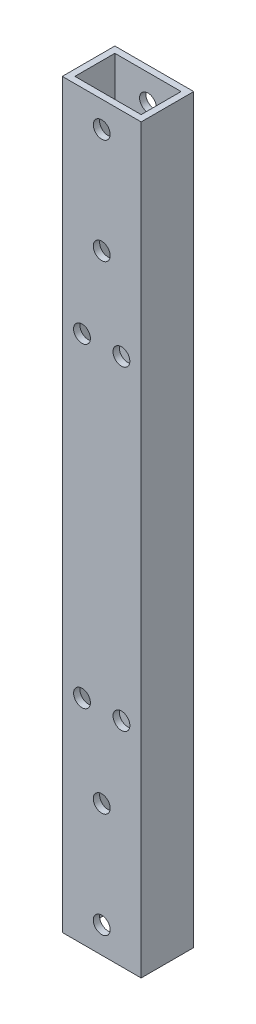
ISO-10303-21;
HEADER;
FILE_DESCRIPTION(('STEP AP214'),'2;1');
FILE_NAME('part.step','',(''),(''),'','','');
FILE_SCHEMA(('AUTOMOTIVE_DESIGN { 1 0 10303 214 1 1 1 1 }'));
ENDSEC;
DATA;
#1=APPLICATION_CONTEXT('core data for automotive mechanical design processes');
#2=APPLICATION_PROTOCOL_DEFINITION('international standard','automotive_design',2000,#1);
#3=PRODUCT_CONTEXT('',#1,'mechanical');
#4=PRODUCT('Part','Part','',(#3));
#5=PRODUCT_RELATED_PRODUCT_CATEGORY('part','',(#4));
#6=PRODUCT_DEFINITION_FORMATION('','',#4);
#7=PRODUCT_DEFINITION_CONTEXT('part definition',#1,'design');
#8=PRODUCT_DEFINITION('design','',#6,#7);
#9=PRODUCT_DEFINITION_SHAPE('','',#8);
#10=(LENGTH_UNIT() NAMED_UNIT(*) SI_UNIT(.MILLI.,.METRE.));
#11=(NAMED_UNIT(*) PLANE_ANGLE_UNIT() SI_UNIT($,.RADIAN.));
#12=(NAMED_UNIT(*) SI_UNIT($,.STERADIAN.) SOLID_ANGLE_UNIT());
#13=UNCERTAINTY_MEASURE_WITH_UNIT(LENGTH_MEASURE(1.E-05),#10,'distance_accuracy_value','');
#14=(GEOMETRIC_REPRESENTATION_CONTEXT(3) GLOBAL_UNCERTAINTY_ASSIGNED_CONTEXT((#13)) GLOBAL_UNIT_ASSIGNED_CONTEXT((#10,
#11,#12)) REPRESENTATION_CONTEXT('',''));
#15=CARTESIAN_POINT('',(0.,0.,0.));
#16=DIRECTION('',(0.,0.,1.));
#17=DIRECTION('',(1.,0.,0.));
#18=AXIS2_PLACEMENT_3D('',#15,#16,#17);
#19=CARTESIAN_POINT('',(0.,70.5,0.));
#20=DIRECTION('',(0.,1.,0.));
#21=DIRECTION('',(0.,0.,1.));
#22=AXIS2_PLACEMENT_3D('',#19,#20,#21);
#23=PLANE('',#22);
#24=DIRECTION('',(0.,0.,-1.));
#25=VECTOR('',#24,1.);
#26=CARTESIAN_POINT('',(7.5,70.5,-5.));
#27=LINE('',#26,#25);
#28=CARTESIAN_POINT('',(7.5,70.5,5.));
#29=VERTEX_POINT('',#28);
#30=CARTESIAN_POINT('',(7.5,70.5,-5.));
#31=VERTEX_POINT('',#30);
#32=EDGE_CURVE('E165',#29,#31,#27,.T.);
#33=ORIENTED_EDGE('',*,*,#32,.T.);
#34=DIRECTION('',(-1.,0.,0.));
#35=VECTOR('',#34,1.);
#36=CARTESIAN_POINT('',(-7.5,70.5,-5.));
#37=LINE('',#36,#35);
#38=CARTESIAN_POINT('',(-7.5,70.5,-5.));
#39=VERTEX_POINT('',#38);
#40=EDGE_CURVE('E169',#31,#39,#37,.T.);
#41=ORIENTED_EDGE('',*,*,#40,.T.);
#42=DIRECTION('',(0.,0.,1.));
#43=VECTOR('',#42,1.);
#44=CARTESIAN_POINT('',(-7.5,70.5,-5.));
#45=LINE('',#44,#43);
#46=CARTESIAN_POINT('',(-7.5,70.5,5.));
#47=VERTEX_POINT('',#46);
#48=EDGE_CURVE('E173',#39,#47,#45,.T.);
#49=ORIENTED_EDGE('',*,*,#48,.T.);
#50=DIRECTION('',(1.,0.,0.));
#51=VECTOR('',#50,1.);
#52=CARTESIAN_POINT('',(-7.5,70.5,5.));
#53=LINE('',#52,#51);
#54=EDGE_CURVE('E176',#47,#29,#53,.T.);
#55=ORIENTED_EDGE('',*,*,#54,.T.);
#56=EDGE_LOOP('',(#33,#41,#49,#55));
#57=FACE_BOUND('',#56,.T.);
#58=DIRECTION('',(1.,0.,0.));
#59=VECTOR('',#58,1.);
#60=CARTESIAN_POINT('',(-6.3,70.5,3.8));
#61=LINE('',#60,#59);
#62=CARTESIAN_POINT('',(-6.3,70.5,3.8));
#63=VERTEX_POINT('',#62);
#64=CARTESIAN_POINT('',(6.3,70.5,3.8));
#65=VERTEX_POINT('',#64);
#66=EDGE_CURVE('E124',#63,#65,#61,.T.);
#67=ORIENTED_EDGE('',*,*,#66,.F.);
#68=DIRECTION('',(0.,0.,1.));
#69=VECTOR('',#68,1.);
#70=CARTESIAN_POINT('',(-6.3,70.5,-3.8));
#71=LINE('',#70,#69);
#72=CARTESIAN_POINT('',(-6.3,70.5,-3.8));
#73=VERTEX_POINT('',#72);
#74=EDGE_CURVE('E115',#73,#63,#71,.T.);
#75=ORIENTED_EDGE('',*,*,#74,.F.);
#76=DIRECTION('',(-1.,0.,0.));
#77=VECTOR('',#76,1.);
#78=CARTESIAN_POINT('',(-6.3,70.5,-3.8));
#79=LINE('',#78,#77);
#80=CARTESIAN_POINT('',(6.3,70.5,-3.8));
#81=VERTEX_POINT('',#80);
#82=EDGE_CURVE('E141',#81,#73,#79,.T.);
#83=ORIENTED_EDGE('',*,*,#82,.F.);
#84=DIRECTION('',(0.,0.,-1.));
#85=VECTOR('',#84,1.);
#86=CARTESIAN_POINT('',(6.3,70.5,-3.8));
#87=LINE('',#86,#85);
#88=EDGE_CURVE('E137',#65,#81,#87,.T.);
#89=ORIENTED_EDGE('',*,*,#88,.F.);
#90=EDGE_LOOP('',(#67,#75,#83,#89));
#91=FACE_BOUND('',#90,.T.);
#92=ADVANCED_FACE('F47',(#57,#91),#23,.T.);
#93=CARTESIAN_POINT('',(0.,-70.5,0.));
#94=DIRECTION('',(0.,1.,0.));
#95=DIRECTION('',(0.,0.,1.));
#96=AXIS2_PLACEMENT_3D('',#93,#94,#95);
#97=PLANE('',#96);
#98=DIRECTION('',(0.,0.,-1.));
#99=VECTOR('',#98,1.);
#100=CARTESIAN_POINT('',(7.5,-70.5,-5.));
#101=LINE('',#100,#99);
#102=CARTESIAN_POINT('',(7.5,-70.5,5.));
#103=VERTEX_POINT('',#102);
#104=CARTESIAN_POINT('',(7.5,-70.5,-5.));
#105=VERTEX_POINT('',#104);
#106=EDGE_CURVE('E133',#103,#105,#101,.T.);
#107=ORIENTED_EDGE('',*,*,#106,.F.);
#108=DIRECTION('',(1.,0.,0.));
#109=VECTOR('',#108,1.);
#110=CARTESIAN_POINT('',(-7.5,-70.5,5.));
#111=LINE('',#110,#109);
#112=CARTESIAN_POINT('',(-7.5,-70.5,5.));
#113=VERTEX_POINT('',#112);
#114=EDGE_CURVE('E170',#113,#103,#111,.T.);
#115=ORIENTED_EDGE('',*,*,#114,.F.);
#116=DIRECTION('',(0.,0.,1.));
#117=VECTOR('',#116,1.);
#118=CARTESIAN_POINT('',(-7.5,-70.5,-5.));
#119=LINE('',#118,#117);
#120=CARTESIAN_POINT('',(-7.5,-70.5,-5.));
#121=VERTEX_POINT('',#120);
#122=EDGE_CURVE('E186',#121,#113,#119,.T.);
#123=ORIENTED_EDGE('',*,*,#122,.F.);
#124=DIRECTION('',(-1.,0.,0.));
#125=VECTOR('',#124,1.);
#126=CARTESIAN_POINT('',(-7.5,-70.5,-5.));
#127=LINE('',#126,#125);
#128=EDGE_CURVE('E183',#105,#121,#127,.T.);
#129=ORIENTED_EDGE('',*,*,#128,.F.);
#130=EDGE_LOOP('',(#107,#115,#123,#129));
#131=FACE_BOUND('',#130,.T.);
#132=DIRECTION('',(0.,0.,1.));
#133=VECTOR('',#132,1.);
#134=CARTESIAN_POINT('',(-6.3,-70.5,-3.8));
#135=LINE('',#134,#133);
#136=CARTESIAN_POINT('',(-6.3,-70.5,-3.8));
#137=VERTEX_POINT('',#136);
#138=CARTESIAN_POINT('',(-6.3,-70.5,3.8));
#139=VERTEX_POINT('',#138);
#140=EDGE_CURVE('E73',#137,#139,#135,.T.);
#141=ORIENTED_EDGE('',*,*,#140,.T.);
#142=DIRECTION('',(1.,0.,0.));
#143=VECTOR('',#142,1.);
#144=CARTESIAN_POINT('',(-6.3,-70.5,3.8));
#145=LINE('',#144,#143);
#146=CARTESIAN_POINT('',(6.3,-70.5,3.8));
#147=VERTEX_POINT('',#146);
#148=EDGE_CURVE('E131',#139,#147,#145,.T.);
#149=ORIENTED_EDGE('',*,*,#148,.T.);
#150=DIRECTION('',(0.,0.,-1.));
#151=VECTOR('',#150,1.);
#152=CARTESIAN_POINT('',(6.3,-70.5,-3.8));
#153=LINE('',#152,#151);
#154=CARTESIAN_POINT('',(6.3,-70.5,-3.8));
#155=VERTEX_POINT('',#154);
#156=EDGE_CURVE('E152',#147,#155,#153,.T.);
#157=ORIENTED_EDGE('',*,*,#156,.T.);
#158=DIRECTION('',(-1.,0.,0.));
#159=VECTOR('',#158,1.);
#160=CARTESIAN_POINT('',(-6.3,-70.5,-3.8));
#161=LINE('',#160,#159);
#162=EDGE_CURVE('E125',#155,#137,#161,.T.);
#163=ORIENTED_EDGE('',*,*,#162,.T.);
#164=EDGE_LOOP('',(#141,#149,#157,#163));
#165=FACE_BOUND('',#164,.T.);
#166=ADVANCED_FACE('F288',(#131,#165),#97,.F.);
#167=CARTESIAN_POINT('',(7.5,70.5,-5.));
#168=DIRECTION('',(-1.,0.,0.));
#169=DIRECTION('',(0.,0.,1.));
#170=AXIS2_PLACEMENT_3D('',#167,#168,#169);
#171=PLANE('',#170);
#172=ORIENTED_EDGE('',*,*,#106,.T.);
#173=DIRECTION('',(0.,-1.,0.));
#174=VECTOR('',#173,1.);
#175=CARTESIAN_POINT('',(7.5,70.5,-5.));
#176=LINE('',#175,#174);
#177=EDGE_CURVE('E11',#31,#105,#176,.T.);
#178=ORIENTED_EDGE('',*,*,#177,.F.);
#179=ORIENTED_EDGE('',*,*,#32,.F.);
#180=DIRECTION('',(0.,-1.,0.));
#181=VECTOR('',#180,1.);
#182=CARTESIAN_POINT('',(7.5,70.5,5.));
#183=LINE('',#182,#181);
#184=EDGE_CURVE('E179',#29,#103,#183,.T.);
#185=ORIENTED_EDGE('',*,*,#184,.T.);
#186=EDGE_LOOP('',(#172,#178,#179,#185));
#187=FACE_BOUND('',#186,.T.);
#188=ADVANCED_FACE('F49',(#187),#171,.F.);
#189=CARTESIAN_POINT('',(-7.5,70.5,-5.));
#190=DIRECTION('',(0.,0.,1.));
#191=DIRECTION('',(1.,0.,0.));
#192=AXIS2_PLACEMENT_3D('',#189,#190,#191);
#193=PLANE('',#192);
#194=CARTESIAN_POINT('',(0.,-65.5,-5.));
#195=DIRECTION('',(0.,0.,-1.));
#196=DIRECTION('',(-1.,0.,0.));
#197=AXIS2_PLACEMENT_3D('',#194,#195,#196);
#198=CIRCLE('',#197,1.60000000000001);
#199=CARTESIAN_POINT('',(-1.60000000000001,-65.5,-5.));
#200=VERTEX_POINT('',#199);
#201=EDGE_CURVE('E206',#200,#200,#198,.T.);
#202=ORIENTED_EDGE('',*,*,#201,.F.);
#203=EDGE_LOOP('',(#202));
#204=FACE_BOUND('',#203,.T.);
#205=CARTESIAN_POINT('',(-3.75,30.,-5.));
#206=DIRECTION('',(0.,0.,-1.));
#207=DIRECTION('',(1.,0.,0.));
#208=AXIS2_PLACEMENT_3D('',#205,#206,#207);
#209=CIRCLE('',#208,1.6);
#210=CARTESIAN_POINT('',(-2.15,30.,-5.));
#211=VERTEX_POINT('',#210);
#212=EDGE_CURVE('E318',#211,#211,#209,.T.);
#213=ORIENTED_EDGE('',*,*,#212,.F.);
#214=EDGE_LOOP('',(#213));
#215=FACE_BOUND('',#214,.T.);
#216=CARTESIAN_POINT('',(3.75,30.,-5.));
#217=DIRECTION('',(0.,0.,-1.));
#218=DIRECTION('',(-1.,0.,0.));
#219=AXIS2_PLACEMENT_3D('',#216,#217,#218);
#220=CIRCLE('',#219,1.6);
#221=CARTESIAN_POINT('',(2.15,30.,-5.));
#222=VERTEX_POINT('',#221);
#223=EDGE_CURVE('E322',#222,#222,#220,.T.);
#224=ORIENTED_EDGE('',*,*,#223,.F.);
#225=EDGE_LOOP('',(#224));
#226=FACE_BOUND('',#225,.T.);
#227=CARTESIAN_POINT('',(3.75,-30.,-5.));
#228=DIRECTION('',(0.,0.,-1.));
#229=DIRECTION('',(1.,0.,0.));
#230=AXIS2_PLACEMENT_3D('',#227,#228,#229);
#231=CIRCLE('',#230,1.6);
#232=CARTESIAN_POINT('',(5.35,-30.,-5.));
#233=VERTEX_POINT('',#232);
#234=EDGE_CURVE('E326',#233,#233,#231,.T.);
#235=ORIENTED_EDGE('',*,*,#234,.F.);
#236=EDGE_LOOP('',(#235));
#237=FACE_BOUND('',#236,.T.);
#238=CARTESIAN_POINT('',(0.,-45.5,-5.));
#239=DIRECTION('',(0.,0.,-1.));
#240=DIRECTION('',(-1.,0.,0.));
#241=AXIS2_PLACEMENT_3D('',#238,#239,#240);
#242=CIRCLE('',#241,1.6);
#243=CARTESIAN_POINT('',(-1.6,-45.5,-5.));
#244=VERTEX_POINT('',#243);
#245=EDGE_CURVE('E330',#244,#244,#242,.T.);
#246=ORIENTED_EDGE('',*,*,#245,.F.);
#247=EDGE_LOOP('',(#246));
#248=FACE_BOUND('',#247,.T.);
#249=CARTESIAN_POINT('',(0.,45.5,-5.));
#250=DIRECTION('',(0.,0.,-1.));
#251=DIRECTION('',(1.,0.,0.));
#252=AXIS2_PLACEMENT_3D('',#249,#250,#251);
#253=CIRCLE('',#252,1.6);
#254=CARTESIAN_POINT('',(1.59999999999999,45.5,-5.));
#255=VERTEX_POINT('',#254);
#256=EDGE_CURVE('E334',#255,#255,#253,.T.);
#257=ORIENTED_EDGE('',*,*,#256,.F.);
#258=EDGE_LOOP('',(#257));
#259=FACE_BOUND('',#258,.T.);
#260=CARTESIAN_POINT('',(0.,65.5,-5.));
#261=DIRECTION('',(0.,0.,-1.));
#262=DIRECTION('',(1.,0.,0.));
#263=AXIS2_PLACEMENT_3D('',#260,#261,#262);
#264=CIRCLE('',#263,1.60000000000001);
#265=CARTESIAN_POINT('',(1.6,65.5,-5.));
#266=VERTEX_POINT('',#265);
#267=EDGE_CURVE('E338',#266,#266,#264,.T.);
#268=ORIENTED_EDGE('',*,*,#267,.F.);
#269=EDGE_LOOP('',(#268));
#270=FACE_BOUND('',#269,.T.);
#271=CARTESIAN_POINT('',(-3.75,-30.,-5.));
#272=DIRECTION('',(0.,0.,-1.));
#273=DIRECTION('',(-1.,0.,0.));
#274=AXIS2_PLACEMENT_3D('',#271,#272,#273);
#275=CIRCLE('',#274,1.6);
#276=CARTESIAN_POINT('',(-5.35,-30.,-5.));
#277=VERTEX_POINT('',#276);
#278=EDGE_CURVE('E342',#277,#277,#275,.T.);
#279=ORIENTED_EDGE('',*,*,#278,.F.);
#280=EDGE_LOOP('',(#279));
#281=FACE_BOUND('',#280,.T.);
#282=ORIENTED_EDGE('',*,*,#128,.T.);
#283=DIRECTION('',(0.,-1.,0.));
#284=VECTOR('',#283,1.);
#285=CARTESIAN_POINT('',(-7.5,70.5,-5.));
#286=LINE('',#285,#284);
#287=EDGE_CURVE('E57',#39,#121,#286,.T.);
#288=ORIENTED_EDGE('',*,*,#287,.F.);
#289=ORIENTED_EDGE('',*,*,#40,.F.);
#290=ORIENTED_EDGE('',*,*,#177,.T.);
#291=EDGE_LOOP('',(#282,#288,#289,#290));
#292=FACE_BOUND('',#291,.T.);
#293=ADVANCED_FACE('F303',(#204,#215,#226,#237,#248,#259,#270,#281,#292),#193,.F.);
#294=CARTESIAN_POINT('',(-7.5,70.5,-5.));
#295=DIRECTION('',(1.,0.,0.));
#296=DIRECTION('',(0.,0.,-1.));
#297=AXIS2_PLACEMENT_3D('',#294,#295,#296);
#298=PLANE('',#297);
#299=ORIENTED_EDGE('',*,*,#122,.T.);
#300=DIRECTION('',(0.,-1.,0.));
#301=VECTOR('',#300,1.);
#302=CARTESIAN_POINT('',(-7.5,70.5,5.));
#303=LINE('',#302,#301);
#304=EDGE_CURVE('E194',#47,#113,#303,.T.);
#305=ORIENTED_EDGE('',*,*,#304,.F.);
#306=ORIENTED_EDGE('',*,*,#48,.F.);
#307=ORIENTED_EDGE('',*,*,#287,.T.);
#308=EDGE_LOOP('',(#299,#305,#306,#307));
#309=FACE_BOUND('',#308,.T.);
#310=ADVANCED_FACE('F301',(#309),#298,.F.);
#311=CARTESIAN_POINT('',(-7.5,70.5,5.));
#312=DIRECTION('',(0.,0.,-1.));
#313=DIRECTION('',(-1.,0.,0.));
#314=AXIS2_PLACEMENT_3D('',#311,#312,#313);
#315=PLANE('',#314);
#316=CARTESIAN_POINT('',(0.,-65.5,5.));
#317=DIRECTION('',(0.,0.,-1.));
#318=DIRECTION('',(-1.,0.,0.));
#319=AXIS2_PLACEMENT_3D('',#316,#317,#318);
#320=CIRCLE('',#319,1.60000000000001);
#321=CARTESIAN_POINT('',(-1.60000000000001,-65.5,5.));
#322=VERTEX_POINT('',#321);
#323=EDGE_CURVE('E149',#322,#322,#320,.T.);
#324=ORIENTED_EDGE('',*,*,#323,.T.);
#325=EDGE_LOOP('',(#324));
#326=FACE_BOUND('',#325,.T.);
#327=CARTESIAN_POINT('',(-3.75,30.,5.));
#328=DIRECTION('',(0.,0.,-1.));
#329=DIRECTION('',(-1.,0.,0.));
#330=AXIS2_PLACEMENT_3D('',#327,#328,#329);
#331=CIRCLE('',#330,1.6);
#332=CARTESIAN_POINT('',(-5.35,30.,5.));
#333=VERTEX_POINT('',#332);
#334=EDGE_CURVE('E246',#333,#333,#331,.T.);
#335=ORIENTED_EDGE('',*,*,#334,.T.);
#336=EDGE_LOOP('',(#335));
#337=FACE_BOUND('',#336,.T.);
#338=CARTESIAN_POINT('',(3.75,30.,5.));
#339=DIRECTION('',(0.,0.,-1.));
#340=DIRECTION('',(-1.,0.,0.));
#341=AXIS2_PLACEMENT_3D('',#338,#339,#340);
#342=CIRCLE('',#341,1.6);
#343=CARTESIAN_POINT('',(2.15,30.,5.));
#344=VERTEX_POINT('',#343);
#345=EDGE_CURVE('E240',#344,#344,#342,.T.);
#346=ORIENTED_EDGE('',*,*,#345,.T.);
#347=EDGE_LOOP('',(#346));
#348=FACE_BOUND('',#347,.T.);
#349=CARTESIAN_POINT('',(3.75,-30.,5.));
#350=DIRECTION('',(0.,0.,-1.));
#351=DIRECTION('',(-1.,0.,0.));
#352=AXIS2_PLACEMENT_3D('',#349,#350,#351);
#353=CIRCLE('',#352,1.6);
#354=CARTESIAN_POINT('',(2.15,-30.,5.));
#355=VERTEX_POINT('',#354);
#356=EDGE_CURVE('E235',#355,#355,#353,.T.);
#357=ORIENTED_EDGE('',*,*,#356,.T.);
#358=EDGE_LOOP('',(#357));
#359=FACE_BOUND('',#358,.T.);
#360=CARTESIAN_POINT('',(0.,-45.5,5.));
#361=DIRECTION('',(0.,0.,-1.));
#362=DIRECTION('',(-1.,0.,0.));
#363=AXIS2_PLACEMENT_3D('',#360,#361,#362);
#364=CIRCLE('',#363,1.6);
#365=CARTESIAN_POINT('',(-1.6,-45.5,5.));
#366=VERTEX_POINT('',#365);
#367=EDGE_CURVE('E230',#366,#366,#364,.T.);
#368=ORIENTED_EDGE('',*,*,#367,.T.);
#369=EDGE_LOOP('',(#368));
#370=FACE_BOUND('',#369,.T.);
#371=CARTESIAN_POINT('',(0.,45.5,5.));
#372=DIRECTION('',(0.,0.,-1.));
#373=DIRECTION('',(-1.,0.,0.));
#374=AXIS2_PLACEMENT_3D('',#371,#372,#373);
#375=CIRCLE('',#374,1.6);
#376=CARTESIAN_POINT('',(-1.6,45.5,5.));
#377=VERTEX_POINT('',#376);
#378=EDGE_CURVE('E224',#377,#377,#375,.T.);
#379=ORIENTED_EDGE('',*,*,#378,.T.);
#380=EDGE_LOOP('',(#379));
#381=FACE_BOUND('',#380,.T.);
#382=CARTESIAN_POINT('',(0.,65.5,5.));
#383=DIRECTION('',(0.,0.,-1.));
#384=DIRECTION('',(-1.,0.,0.));
#385=AXIS2_PLACEMENT_3D('',#382,#383,#384);
#386=CIRCLE('',#385,1.60000000000001);
#387=CARTESIAN_POINT('',(-1.60000000000001,65.5,5.));
#388=VERTEX_POINT('',#387);
#389=EDGE_CURVE('E218',#388,#388,#386,.T.);
#390=ORIENTED_EDGE('',*,*,#389,.T.);
#391=EDGE_LOOP('',(#390));
#392=FACE_BOUND('',#391,.T.);
#393=CARTESIAN_POINT('',(-3.75,-30.,5.));
#394=DIRECTION('',(0.,0.,-1.));
#395=DIRECTION('',(-1.,0.,0.));
#396=AXIS2_PLACEMENT_3D('',#393,#394,#395);
#397=CIRCLE('',#396,1.6);
#398=CARTESIAN_POINT('',(-5.35,-30.,5.));
#399=VERTEX_POINT('',#398);
#400=EDGE_CURVE('E212',#399,#399,#397,.T.);
#401=ORIENTED_EDGE('',*,*,#400,.T.);
#402=EDGE_LOOP('',(#401));
#403=FACE_BOUND('',#402,.T.);
#404=ORIENTED_EDGE('',*,*,#114,.T.);
#405=ORIENTED_EDGE('',*,*,#184,.F.);
#406=ORIENTED_EDGE('',*,*,#54,.F.);
#407=ORIENTED_EDGE('',*,*,#304,.T.);
#408=EDGE_LOOP('',(#404,#405,#406,#407));
#409=FACE_BOUND('',#408,.T.);
#410=ADVANCED_FACE('F267',(#326,#337,#348,#359,#370,#381,#392,#403,#409),#315,.F.);
#411=CARTESIAN_POINT('',(-6.3,70.5,-3.8));
#412=DIRECTION('',(1.,0.,0.));
#413=DIRECTION('',(0.,0.,-1.));
#414=AXIS2_PLACEMENT_3D('',#411,#412,#413);
#415=PLANE('',#414);
#416=ORIENTED_EDGE('',*,*,#140,.F.);
#417=DIRECTION('',(0.,-1.,0.));
#418=VECTOR('',#417,1.);
#419=CARTESIAN_POINT('',(-6.3,70.5,-3.8));
#420=LINE('',#419,#418);
#421=EDGE_CURVE('E119',#73,#137,#420,.T.);
#422=ORIENTED_EDGE('',*,*,#421,.F.);
#423=ORIENTED_EDGE('',*,*,#74,.T.);
#424=DIRECTION('',(0.,-1.,0.));
#425=VECTOR('',#424,1.);
#426=CARTESIAN_POINT('',(-6.3,70.5,3.8));
#427=LINE('',#426,#425);
#428=EDGE_CURVE('E118',#63,#139,#427,.T.);
#429=ORIENTED_EDGE('',*,*,#428,.T.);
#430=EDGE_LOOP('',(#416,#422,#423,#429));
#431=FACE_BOUND('',#430,.T.);
#432=ADVANCED_FACE('F117',(#431),#415,.T.);
#433=CARTESIAN_POINT('',(-6.3,70.5,3.8));
#434=DIRECTION('',(0.,0.,-1.));
#435=DIRECTION('',(-1.,0.,0.));
#436=AXIS2_PLACEMENT_3D('',#433,#434,#435);
#437=PLANE('',#436);
#438=CARTESIAN_POINT('',(0.,-65.5,3.8));
#439=DIRECTION('',(0.,0.,-1.));
#440=DIRECTION('',(-1.,0.,0.));
#441=AXIS2_PLACEMENT_3D('',#438,#439,#440);
#442=CIRCLE('',#441,1.60000000000001);
#443=CARTESIAN_POINT('',(-1.60000000000001,-65.5,3.8));
#444=VERTEX_POINT('',#443);
#445=EDGE_CURVE('E260',#444,#444,#442,.T.);
#446=ORIENTED_EDGE('',*,*,#445,.F.);
#447=EDGE_LOOP('',(#446));
#448=FACE_BOUND('',#447,.T.);
#449=CARTESIAN_POINT('',(-3.75,30.,3.8));
#450=DIRECTION('',(0.,0.,-1.));
#451=DIRECTION('',(-1.,0.,0.));
#452=AXIS2_PLACEMENT_3D('',#449,#450,#451);
#453=CIRCLE('',#452,1.6);
#454=CARTESIAN_POINT('',(-5.35,30.,3.8));
#455=VERTEX_POINT('',#454);
#456=EDGE_CURVE('E239',#455,#455,#453,.T.);
#457=ORIENTED_EDGE('',*,*,#456,.F.);
#458=EDGE_LOOP('',(#457));
#459=FACE_BOUND('',#458,.T.);
#460=CARTESIAN_POINT('',(3.75,30.,3.8));
#461=DIRECTION('',(0.,0.,-1.));
#462=DIRECTION('',(-1.,0.,0.));
#463=AXIS2_PLACEMENT_3D('',#460,#461,#462);
#464=CIRCLE('',#463,1.6);
#465=CARTESIAN_POINT('',(2.15,30.,3.8));
#466=VERTEX_POINT('',#465);
#467=EDGE_CURVE('E234',#466,#466,#464,.T.);
#468=ORIENTED_EDGE('',*,*,#467,.F.);
#469=EDGE_LOOP('',(#468));
#470=FACE_BOUND('',#469,.T.);
#471=CARTESIAN_POINT('',(3.75,-30.,3.8));
#472=DIRECTION('',(0.,0.,-1.));
#473=DIRECTION('',(-1.,0.,0.));
#474=AXIS2_PLACEMENT_3D('',#471,#472,#473);
#475=CIRCLE('',#474,1.6);
#476=CARTESIAN_POINT('',(2.15,-30.,3.8));
#477=VERTEX_POINT('',#476);
#478=EDGE_CURVE('E229',#477,#477,#475,.T.);
#479=ORIENTED_EDGE('',*,*,#478,.F.);
#480=EDGE_LOOP('',(#479));
#481=FACE_BOUND('',#480,.T.);
#482=CARTESIAN_POINT('',(0.,-45.5,3.8));
#483=DIRECTION('',(0.,0.,-1.));
#484=DIRECTION('',(-1.,0.,0.));
#485=AXIS2_PLACEMENT_3D('',#482,#483,#484);
#486=CIRCLE('',#485,1.6);
#487=CARTESIAN_POINT('',(-1.6,-45.5,3.8));
#488=VERTEX_POINT('',#487);
#489=EDGE_CURVE('E223',#488,#488,#486,.T.);
#490=ORIENTED_EDGE('',*,*,#489,.F.);
#491=EDGE_LOOP('',(#490));
#492=FACE_BOUND('',#491,.T.);
#493=CARTESIAN_POINT('',(0.,45.5,3.8));
#494=DIRECTION('',(0.,0.,-1.));
#495=DIRECTION('',(-1.,0.,0.));
#496=AXIS2_PLACEMENT_3D('',#493,#494,#495);
#497=CIRCLE('',#496,1.6);
#498=CARTESIAN_POINT('',(-1.6,45.5,3.8));
#499=VERTEX_POINT('',#498);
#500=EDGE_CURVE('E217',#499,#499,#497,.T.);
#501=ORIENTED_EDGE('',*,*,#500,.F.);
#502=EDGE_LOOP('',(#501));
#503=FACE_BOUND('',#502,.T.);
#504=CARTESIAN_POINT('',(0.,65.5,3.8));
#505=DIRECTION('',(0.,0.,-1.));
#506=DIRECTION('',(-1.,0.,0.));
#507=AXIS2_PLACEMENT_3D('',#504,#505,#506);
#508=CIRCLE('',#507,1.60000000000001);
#509=CARTESIAN_POINT('',(-1.60000000000001,65.5,3.8));
#510=VERTEX_POINT('',#509);
#511=EDGE_CURVE('E211',#510,#510,#508,.T.);
#512=ORIENTED_EDGE('',*,*,#511,.F.);
#513=EDGE_LOOP('',(#512));
#514=FACE_BOUND('',#513,.T.);
#515=CARTESIAN_POINT('',(-3.75,-30.,3.8));
#516=DIRECTION('',(0.,0.,-1.));
#517=DIRECTION('',(-1.,0.,0.));
#518=AXIS2_PLACEMENT_3D('',#515,#516,#517);
#519=CIRCLE('',#518,1.6);
#520=CARTESIAN_POINT('',(-5.35,-30.,3.8));
#521=VERTEX_POINT('',#520);
#522=EDGE_CURVE('E205',#521,#521,#519,.T.);
#523=ORIENTED_EDGE('',*,*,#522,.F.);
#524=EDGE_LOOP('',(#523));
#525=FACE_BOUND('',#524,.T.);
#526=ORIENTED_EDGE('',*,*,#148,.F.);
#527=ORIENTED_EDGE('',*,*,#428,.F.);
#528=ORIENTED_EDGE('',*,*,#66,.T.);
#529=DIRECTION('',(0.,-1.,0.));
#530=VECTOR('',#529,1.);
#531=CARTESIAN_POINT('',(6.3,70.5,3.8));
#532=LINE('',#531,#530);
#533=EDGE_CURVE('E134',#65,#147,#532,.T.);
#534=ORIENTED_EDGE('',*,*,#533,.T.);
#535=EDGE_LOOP('',(#526,#527,#528,#534));
#536=FACE_BOUND('',#535,.T.);
#537=ADVANCED_FACE('F128',(#448,#459,#470,#481,#492,#503,#514,#525,#536),#437,.T.);
#538=CARTESIAN_POINT('',(6.3,70.5,-3.8));
#539=DIRECTION('',(-1.,0.,0.));
#540=DIRECTION('',(0.,0.,1.));
#541=AXIS2_PLACEMENT_3D('',#538,#539,#540);
#542=PLANE('',#541);
#543=ORIENTED_EDGE('',*,*,#156,.F.);
#544=ORIENTED_EDGE('',*,*,#533,.F.);
#545=ORIENTED_EDGE('',*,*,#88,.T.);
#546=DIRECTION('',(0.,-1.,0.));
#547=VECTOR('',#546,1.);
#548=CARTESIAN_POINT('',(6.3,70.5,-3.8));
#549=LINE('',#548,#547);
#550=EDGE_CURVE('E65',#81,#155,#549,.T.);
#551=ORIENTED_EDGE('',*,*,#550,.T.);
#552=EDGE_LOOP('',(#543,#544,#545,#551));
#553=FACE_BOUND('',#552,.T.);
#554=ADVANCED_FACE('F359',(#553),#542,.T.);
#555=CARTESIAN_POINT('',(-6.3,70.5,-3.8));
#556=DIRECTION('',(0.,0.,1.));
#557=DIRECTION('',(1.,0.,0.));
#558=AXIS2_PLACEMENT_3D('',#555,#556,#557);
#559=PLANE('',#558);
#560=CARTESIAN_POINT('',(0.,-65.5,-3.8));
#561=DIRECTION('',(0.,0.,1.));
#562=DIRECTION('',(1.,0.,0.));
#563=AXIS2_PLACEMENT_3D('',#560,#561,#562);
#564=CIRCLE('',#563,1.60000000000001);
#565=CARTESIAN_POINT('',(1.6,-65.5,-3.8));
#566=VERTEX_POINT('',#565);
#567=EDGE_CURVE('E51',#566,#566,#564,.T.);
#568=ORIENTED_EDGE('',*,*,#567,.F.);
#569=EDGE_LOOP('',(#568));
#570=FACE_BOUND('',#569,.T.);
#571=CARTESIAN_POINT('',(-3.75,30.,-3.8));
#572=DIRECTION('',(0.,0.,1.));
#573=DIRECTION('',(1.,0.,0.));
#574=AXIS2_PLACEMENT_3D('',#571,#572,#573);
#575=CIRCLE('',#574,1.6);
#576=CARTESIAN_POINT('',(-2.15,30.,-3.8));
#577=VERTEX_POINT('',#576);
#578=EDGE_CURVE('E236',#577,#577,#575,.T.);
#579=ORIENTED_EDGE('',*,*,#578,.F.);
#580=EDGE_LOOP('',(#579));
#581=FACE_BOUND('',#580,.T.);
#582=CARTESIAN_POINT('',(3.75,30.,-3.8));
#583=DIRECTION('',(0.,0.,1.));
#584=DIRECTION('',(1.,0.,0.));
#585=AXIS2_PLACEMENT_3D('',#582,#583,#584);
#586=CIRCLE('',#585,1.6);
#587=CARTESIAN_POINT('',(5.35,30.,-3.8));
#588=VERTEX_POINT('',#587);
#589=EDGE_CURVE('E231',#588,#588,#586,.T.);
#590=ORIENTED_EDGE('',*,*,#589,.F.);
#591=EDGE_LOOP('',(#590));
#592=FACE_BOUND('',#591,.T.);
#593=CARTESIAN_POINT('',(3.75,-30.,-3.8));
#594=DIRECTION('',(0.,0.,1.));
#595=DIRECTION('',(1.,0.,0.));
#596=AXIS2_PLACEMENT_3D('',#593,#594,#595);
#597=CIRCLE('',#596,1.6);
#598=CARTESIAN_POINT('',(5.35,-30.,-3.8));
#599=VERTEX_POINT('',#598);
#600=EDGE_CURVE('E225',#599,#599,#597,.T.);
#601=ORIENTED_EDGE('',*,*,#600,.F.);
#602=EDGE_LOOP('',(#601));
#603=FACE_BOUND('',#602,.T.);
#604=CARTESIAN_POINT('',(0.,-45.5,-3.8));
#605=DIRECTION('',(0.,0.,1.));
#606=DIRECTION('',(1.,0.,0.));
#607=AXIS2_PLACEMENT_3D('',#604,#605,#606);
#608=CIRCLE('',#607,1.6);
#609=CARTESIAN_POINT('',(1.59999999999999,-45.5,-3.8));
#610=VERTEX_POINT('',#609);
#611=EDGE_CURVE('E219',#610,#610,#608,.T.);
#612=ORIENTED_EDGE('',*,*,#611,.F.);
#613=EDGE_LOOP('',(#612));
#614=FACE_BOUND('',#613,.T.);
#615=CARTESIAN_POINT('',(0.,45.5,-3.8));
#616=DIRECTION('',(0.,0.,1.));
#617=DIRECTION('',(1.,0.,0.));
#618=AXIS2_PLACEMENT_3D('',#615,#616,#617);
#619=CIRCLE('',#618,1.6);
#620=CARTESIAN_POINT('',(1.59999999999999,45.5,-3.8));
#621=VERTEX_POINT('',#620);
#622=EDGE_CURVE('E213',#621,#621,#619,.T.);
#623=ORIENTED_EDGE('',*,*,#622,.F.);
#624=EDGE_LOOP('',(#623));
#625=FACE_BOUND('',#624,.T.);
#626=CARTESIAN_POINT('',(0.,65.5,-3.8));
#627=DIRECTION('',(0.,0.,1.));
#628=DIRECTION('',(1.,0.,0.));
#629=AXIS2_PLACEMENT_3D('',#626,#627,#628);
#630=CIRCLE('',#629,1.60000000000001);
#631=CARTESIAN_POINT('',(1.6,65.5,-3.8));
#632=VERTEX_POINT('',#631);
#633=EDGE_CURVE('E207',#632,#632,#630,.T.);
#634=ORIENTED_EDGE('',*,*,#633,.F.);
#635=EDGE_LOOP('',(#634));
#636=FACE_BOUND('',#635,.T.);
#637=CARTESIAN_POINT('',(-3.75,-30.,-3.8));
#638=DIRECTION('',(0.,0.,1.));
#639=DIRECTION('',(1.,0.,0.));
#640=AXIS2_PLACEMENT_3D('',#637,#638,#639);
#641=CIRCLE('',#640,1.6);
#642=CARTESIAN_POINT('',(-2.15,-30.,-3.8));
#643=VERTEX_POINT('',#642);
#644=EDGE_CURVE('E201',#643,#643,#641,.T.);
#645=ORIENTED_EDGE('',*,*,#644,.F.);
#646=EDGE_LOOP('',(#645));
#647=FACE_BOUND('',#646,.T.);
#648=ORIENTED_EDGE('',*,*,#162,.F.);
#649=ORIENTED_EDGE('',*,*,#550,.F.);
#650=ORIENTED_EDGE('',*,*,#82,.T.);
#651=ORIENTED_EDGE('',*,*,#421,.T.);
#652=EDGE_LOOP('',(#648,#649,#650,#651));
#653=FACE_BOUND('',#652,.T.);
#654=ADVANCED_FACE('F356',(#570,#581,#592,#603,#614,#625,#636,#647,#653),#559,.T.);
#655=CARTESIAN_POINT('',(-3.75,-30.,95.));
#656=DIRECTION('',(0.,0.,-1.));
#657=DIRECTION('',(-1.,0.,0.));
#658=AXIS2_PLACEMENT_3D('',#655,#656,#657);
#659=CYLINDRICAL_SURFACE('',#658,1.6);
#660=ORIENTED_EDGE('',*,*,#644,.T.);
#661=EDGE_LOOP('',(#660));
#662=FACE_BOUND('',#661,.T.);
#663=ORIENTED_EDGE('',*,*,#278,.T.);
#664=EDGE_LOOP('',(#663));
#665=FACE_BOUND('',#664,.T.);
#666=ADVANCED_FACE('F358',(#662,#665),#659,.F.);
#667=CARTESIAN_POINT('',(0.,65.5,95.));
#668=DIRECTION('',(0.,0.,-1.));
#669=DIRECTION('',(-1.,0.,0.));
#670=AXIS2_PLACEMENT_3D('',#667,#668,#669);
#671=CYLINDRICAL_SURFACE('',#670,1.60000000000001);
#672=ORIENTED_EDGE('',*,*,#633,.T.);
#673=EDGE_LOOP('',(#672));
#674=FACE_BOUND('',#673,.T.);
#675=ORIENTED_EDGE('',*,*,#267,.T.);
#676=EDGE_LOOP('',(#675));
#677=FACE_BOUND('',#676,.T.);
#678=ADVANCED_FACE('F366',(#674,#677),#671,.F.);
#679=CARTESIAN_POINT('',(0.,45.5,95.));
#680=DIRECTION('',(0.,0.,-1.));
#681=DIRECTION('',(-1.,0.,0.));
#682=AXIS2_PLACEMENT_3D('',#679,#680,#681);
#683=CYLINDRICAL_SURFACE('',#682,1.6);
#684=ORIENTED_EDGE('',*,*,#622,.T.);
#685=EDGE_LOOP('',(#684));
#686=FACE_BOUND('',#685,.T.);
#687=ORIENTED_EDGE('',*,*,#256,.T.);
#688=EDGE_LOOP('',(#687));
#689=FACE_BOUND('',#688,.T.);
#690=ADVANCED_FACE('F375',(#686,#689),#683,.F.);
#691=CARTESIAN_POINT('',(0.,-45.5,95.));
#692=DIRECTION('',(0.,0.,-1.));
#693=DIRECTION('',(-1.,0.,0.));
#694=AXIS2_PLACEMENT_3D('',#691,#692,#693);
#695=CYLINDRICAL_SURFACE('',#694,1.6);
#696=ORIENTED_EDGE('',*,*,#611,.T.);
#697=EDGE_LOOP('',(#696));
#698=FACE_BOUND('',#697,.T.);
#699=ORIENTED_EDGE('',*,*,#245,.T.);
#700=EDGE_LOOP('',(#699));
#701=FACE_BOUND('',#700,.T.);
#702=ADVANCED_FACE('F446',(#698,#701),#695,.F.);
#703=CARTESIAN_POINT('',(3.75,-30.,95.));
#704=DIRECTION('',(0.,0.,-1.));
#705=DIRECTION('',(-1.,0.,0.));
#706=AXIS2_PLACEMENT_3D('',#703,#704,#705);
#707=CYLINDRICAL_SURFACE('',#706,1.6);
#708=ORIENTED_EDGE('',*,*,#600,.T.);
#709=EDGE_LOOP('',(#708));
#710=FACE_BOUND('',#709,.T.);
#711=ORIENTED_EDGE('',*,*,#234,.T.);
#712=EDGE_LOOP('',(#711));
#713=FACE_BOUND('',#712,.T.);
#714=ADVANCED_FACE('F436',(#710,#713),#707,.F.);
#715=CARTESIAN_POINT('',(3.75,30.,95.));
#716=DIRECTION('',(0.,0.,-1.));
#717=DIRECTION('',(-1.,0.,0.));
#718=AXIS2_PLACEMENT_3D('',#715,#716,#717);
#719=CYLINDRICAL_SURFACE('',#718,1.6);
#720=ORIENTED_EDGE('',*,*,#589,.T.);
#721=EDGE_LOOP('',(#720));
#722=FACE_BOUND('',#721,.T.);
#723=ORIENTED_EDGE('',*,*,#223,.T.);
#724=EDGE_LOOP('',(#723));
#725=FACE_BOUND('',#724,.T.);
#726=ADVANCED_FACE('F443',(#722,#725),#719,.F.);
#727=CARTESIAN_POINT('',(-3.75,30.,95.));
#728=DIRECTION('',(0.,0.,-1.));
#729=DIRECTION('',(-1.,0.,0.));
#730=AXIS2_PLACEMENT_3D('',#727,#728,#729);
#731=CYLINDRICAL_SURFACE('',#730,1.6);
#732=ORIENTED_EDGE('',*,*,#578,.T.);
#733=EDGE_LOOP('',(#732));
#734=FACE_BOUND('',#733,.T.);
#735=ORIENTED_EDGE('',*,*,#212,.T.);
#736=EDGE_LOOP('',(#735));
#737=FACE_BOUND('',#736,.T.);
#738=ADVANCED_FACE('F282',(#734,#737),#731,.F.);
#739=CARTESIAN_POINT('',(0.,-65.5,95.));
#740=DIRECTION('',(0.,0.,-1.));
#741=DIRECTION('',(-1.,0.,0.));
#742=AXIS2_PLACEMENT_3D('',#739,#740,#741);
#743=CYLINDRICAL_SURFACE('',#742,1.60000000000001);
#744=ORIENTED_EDGE('',*,*,#567,.T.);
#745=EDGE_LOOP('',(#744));
#746=FACE_BOUND('',#745,.T.);
#747=ORIENTED_EDGE('',*,*,#201,.T.);
#748=EDGE_LOOP('',(#747));
#749=FACE_BOUND('',#748,.T.);
#750=ADVANCED_FACE('F275',(#746,#749),#743,.F.);
#751=ORIENTED_EDGE('',*,*,#522,.T.);
#752=EDGE_LOOP('',(#751));
#753=FACE_BOUND('',#752,.T.);
#754=ORIENTED_EDGE('',*,*,#400,.F.);
#755=EDGE_LOOP('',(#754));
#756=FACE_BOUND('',#755,.T.);
#757=ADVANCED_FACE('F285',(#753,#756),#659,.F.);
#758=ORIENTED_EDGE('',*,*,#511,.T.);
#759=EDGE_LOOP('',(#758));
#760=FACE_BOUND('',#759,.T.);
#761=ORIENTED_EDGE('',*,*,#389,.F.);
#762=EDGE_LOOP('',(#761));
#763=FACE_BOUND('',#762,.T.);
#764=ADVANCED_FACE('F480',(#760,#763),#671,.F.);
#765=ORIENTED_EDGE('',*,*,#500,.T.);
#766=EDGE_LOOP('',(#765));
#767=FACE_BOUND('',#766,.T.);
#768=ORIENTED_EDGE('',*,*,#378,.F.);
#769=EDGE_LOOP('',(#768));
#770=FACE_BOUND('',#769,.T.);
#771=ADVANCED_FACE('F444',(#767,#770),#683,.F.);
#772=ORIENTED_EDGE('',*,*,#489,.T.);
#773=EDGE_LOOP('',(#772));
#774=FACE_BOUND('',#773,.T.);
#775=ORIENTED_EDGE('',*,*,#367,.F.);
#776=EDGE_LOOP('',(#775));
#777=FACE_BOUND('',#776,.T.);
#778=ADVANCED_FACE('F434',(#774,#777),#695,.F.);
#779=ORIENTED_EDGE('',*,*,#478,.T.);
#780=EDGE_LOOP('',(#779));
#781=FACE_BOUND('',#780,.T.);
#782=ORIENTED_EDGE('',*,*,#356,.F.);
#783=EDGE_LOOP('',(#782));
#784=FACE_BOUND('',#783,.T.);
#785=ADVANCED_FACE('F432',(#781,#784),#707,.F.);
#786=ORIENTED_EDGE('',*,*,#467,.T.);
#787=EDGE_LOOP('',(#786));
#788=FACE_BOUND('',#787,.T.);
#789=ORIENTED_EDGE('',*,*,#345,.F.);
#790=EDGE_LOOP('',(#789));
#791=FACE_BOUND('',#790,.T.);
#792=ADVANCED_FACE('F279',(#788,#791),#719,.F.);
#793=ORIENTED_EDGE('',*,*,#456,.T.);
#794=EDGE_LOOP('',(#793));
#795=FACE_BOUND('',#794,.T.);
#796=ORIENTED_EDGE('',*,*,#334,.F.);
#797=EDGE_LOOP('',(#796));
#798=FACE_BOUND('',#797,.T.);
#799=ADVANCED_FACE('F272',(#795,#798),#731,.F.);
#800=ORIENTED_EDGE('',*,*,#445,.T.);
#801=EDGE_LOOP('',(#800));
#802=FACE_BOUND('',#801,.T.);
#803=ORIENTED_EDGE('',*,*,#323,.F.);
#804=EDGE_LOOP('',(#803));
#805=FACE_BOUND('',#804,.T.);
#806=ADVANCED_FACE('F270',(#802,#805),#743,.F.);
#807=CLOSED_SHELL('',(#92,#166,#188,#293,#310,#410,#432,#537,#554,#654,#666,#678,#690,#702,#714,
#726,#738,#750,#757,#764,#771,#778,#785,#792,#799,#806));
#808=MANIFOLD_SOLID_BREP('B2',#807);
#809=ADVANCED_BREP_SHAPE_REPRESENTATION('',(#18,#808),#14);
#810=SHAPE_DEFINITION_REPRESENTATION(#9,#809);
ENDSEC;
END-ISO-10303-21;
